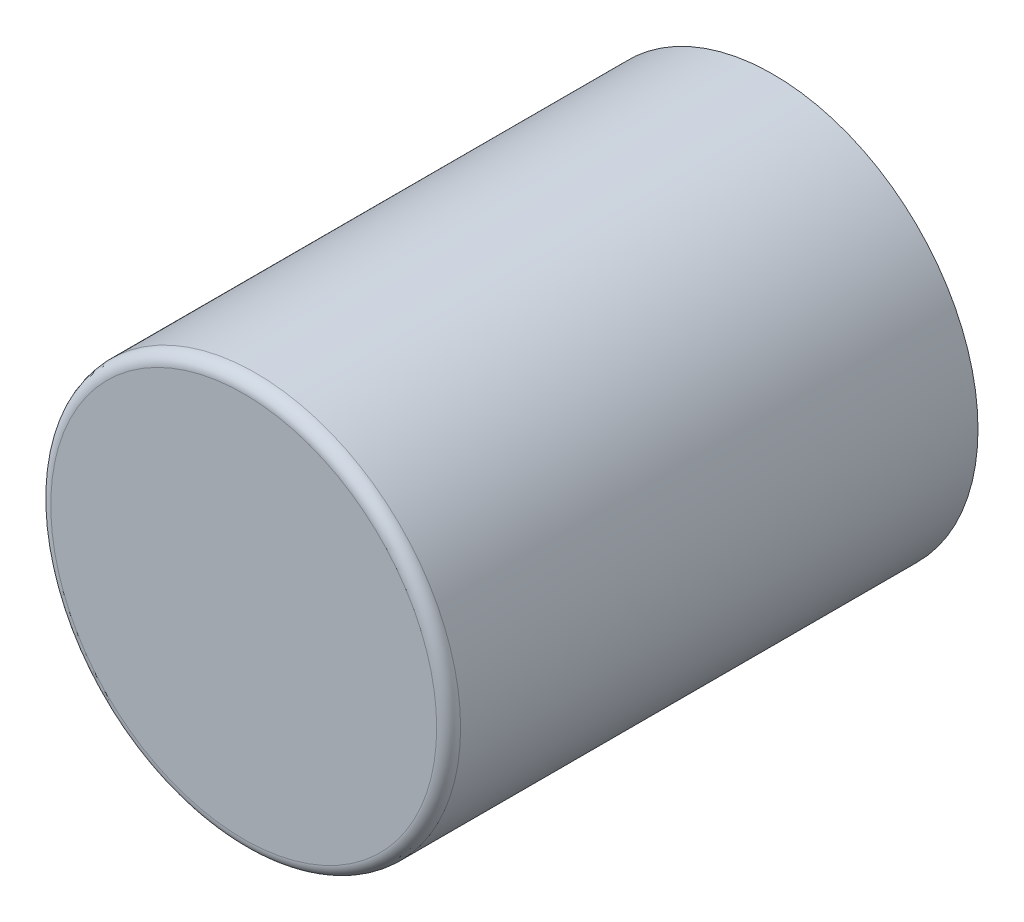
ISO-10303-21;
HEADER;
FILE_DESCRIPTION(('STEP AP214'),'2;1');
FILE_NAME('part.step','',(''),(''),'','','');
FILE_SCHEMA(('AUTOMOTIVE_DESIGN { 1 0 10303 214 1 1 1 1 }'));
ENDSEC;
DATA;
#1=APPLICATION_CONTEXT('core data for automotive mechanical design processes');
#2=APPLICATION_PROTOCOL_DEFINITION('international standard','automotive_design',2000,#1);
#3=PRODUCT_CONTEXT('',#1,'mechanical');
#4=PRODUCT('Part','Part','',(#3));
#5=PRODUCT_RELATED_PRODUCT_CATEGORY('part','',(#4));
#6=PRODUCT_DEFINITION_FORMATION('','',#4);
#7=PRODUCT_DEFINITION_CONTEXT('part definition',#1,'design');
#8=PRODUCT_DEFINITION('design','',#6,#7);
#9=PRODUCT_DEFINITION_SHAPE('','',#8);
#10=(LENGTH_UNIT() NAMED_UNIT(*) SI_UNIT(.MILLI.,.METRE.));
#11=(NAMED_UNIT(*) PLANE_ANGLE_UNIT() SI_UNIT($,.RADIAN.));
#12=(NAMED_UNIT(*) SI_UNIT($,.STERADIAN.) SOLID_ANGLE_UNIT());
#13=UNCERTAINTY_MEASURE_WITH_UNIT(LENGTH_MEASURE(1.E-05),#10,'distance_accuracy_value','');
#14=(GEOMETRIC_REPRESENTATION_CONTEXT(3) GLOBAL_UNCERTAINTY_ASSIGNED_CONTEXT((#13)) GLOBAL_UNIT_ASSIGNED_CONTEXT((#10,
#11,#12)) REPRESENTATION_CONTEXT('',''));
#15=CARTESIAN_POINT('',(0.,0.,0.));
#16=DIRECTION('',(0.,0.,1.));
#17=DIRECTION('',(1.,0.,0.));
#18=AXIS2_PLACEMENT_3D('',#15,#16,#17);
#19=CARTESIAN_POINT('',(0.,0.,31.));
#20=DIRECTION('',(0.,0.,-1.));
#21=DIRECTION('',(-1.,0.,0.));
#22=AXIS2_PLACEMENT_3D('',#19,#20,#21);
#23=CYLINDRICAL_SURFACE('',#22,12.);
#24=CARTESIAN_POINT('',(0.,0.,30.3));
#25=DIRECTION('',(0.,0.,1.));
#26=DIRECTION('',(1.,0.,0.));
#27=AXIS2_PLACEMENT_3D('',#24,#25,#26);
#28=CIRCLE('',#27,12.);
#29=CARTESIAN_POINT('',(12.,0.,30.3));
#30=VERTEX_POINT('',#29);
#31=EDGE_CURVE('E11',#30,#30,#28,.F.);
#32=ORIENTED_EDGE('',*,*,#31,.T.);
#33=EDGE_LOOP('',(#32));
#34=FACE_BOUND('',#33,.T.);
#35=CARTESIAN_POINT('',(0.,0.,0.));
#36=DIRECTION('',(0.,0.,1.));
#37=DIRECTION('',(1.,0.,0.));
#38=AXIS2_PLACEMENT_3D('',#35,#36,#37);
#39=CIRCLE('',#38,12.);
#40=CARTESIAN_POINT('',(12.,0.,0.));
#41=VERTEX_POINT('',#40);
#42=EDGE_CURVE('E60',#41,#41,#39,.T.);
#43=ORIENTED_EDGE('',*,*,#42,.T.);
#44=EDGE_LOOP('',(#43));
#45=FACE_BOUND('',#44,.T.);
#46=ADVANCED_FACE('F49',(#34,#45),#23,.T.);
#47=CARTESIAN_POINT('',(0.,0.,31.));
#48=DIRECTION('',(0.,0.,1.));
#49=DIRECTION('',(1.,0.,0.));
#50=AXIS2_PLACEMENT_3D('',#47,#48,#49);
#51=PLANE('',#50);
#52=CARTESIAN_POINT('',(0.,0.,31.));
#53=DIRECTION('',(0.,0.,1.));
#54=DIRECTION('',(1.,0.,0.));
#55=AXIS2_PLACEMENT_3D('',#52,#53,#54);
#56=CIRCLE('',#55,11.3);
#57=CARTESIAN_POINT('',(11.3,0.,31.));
#58=VERTEX_POINT('',#57);
#59=EDGE_CURVE('E56',#58,#58,#56,.T.);
#60=ORIENTED_EDGE('',*,*,#59,.T.);
#61=EDGE_LOOP('',(#60));
#62=FACE_BOUND('',#61,.T.);
#63=ADVANCED_FACE('F70',(#62),#51,.T.);
#64=CARTESIAN_POINT('',(0.,0.,0.));
#65=DIRECTION('',(0.,0.,1.));
#66=DIRECTION('',(1.,0.,0.));
#67=AXIS2_PLACEMENT_3D('',#64,#65,#66);
#68=PLANE('',#67);
#69=ORIENTED_EDGE('',*,*,#42,.F.);
#70=EDGE_LOOP('',(#69));
#71=FACE_BOUND('',#70,.T.);
#72=ADVANCED_FACE('F68',(#71),#68,.F.);
#73=CARTESIAN_POINT('',(0.,0.,30.3));
#74=DIRECTION('',(0.,0.,1.));
#75=DIRECTION('',(1.,0.,0.));
#76=AXIS2_PLACEMENT_3D('',#73,#74,#75);
#77=TOROIDAL_SURFACE('',#76,11.3,0.7);
#78=ORIENTED_EDGE('',*,*,#31,.F.);
#79=EDGE_LOOP('',(#78));
#80=FACE_BOUND('',#79,.T.);
#81=ORIENTED_EDGE('',*,*,#59,.F.);
#82=EDGE_LOOP('',(#81));
#83=FACE_BOUND('',#82,.T.);
#84=ADVANCED_FACE('F51',(#80,#83),#77,.T.);
#85=CLOSED_SHELL('',(#46,#63,#72,#84));
#86=MANIFOLD_SOLID_BREP('B2',#85);
#87=ADVANCED_BREP_SHAPE_REPRESENTATION('',(#18,#86),#14);
#88=SHAPE_DEFINITION_REPRESENTATION(#9,#87);
ENDSEC;
END-ISO-10303-21;
